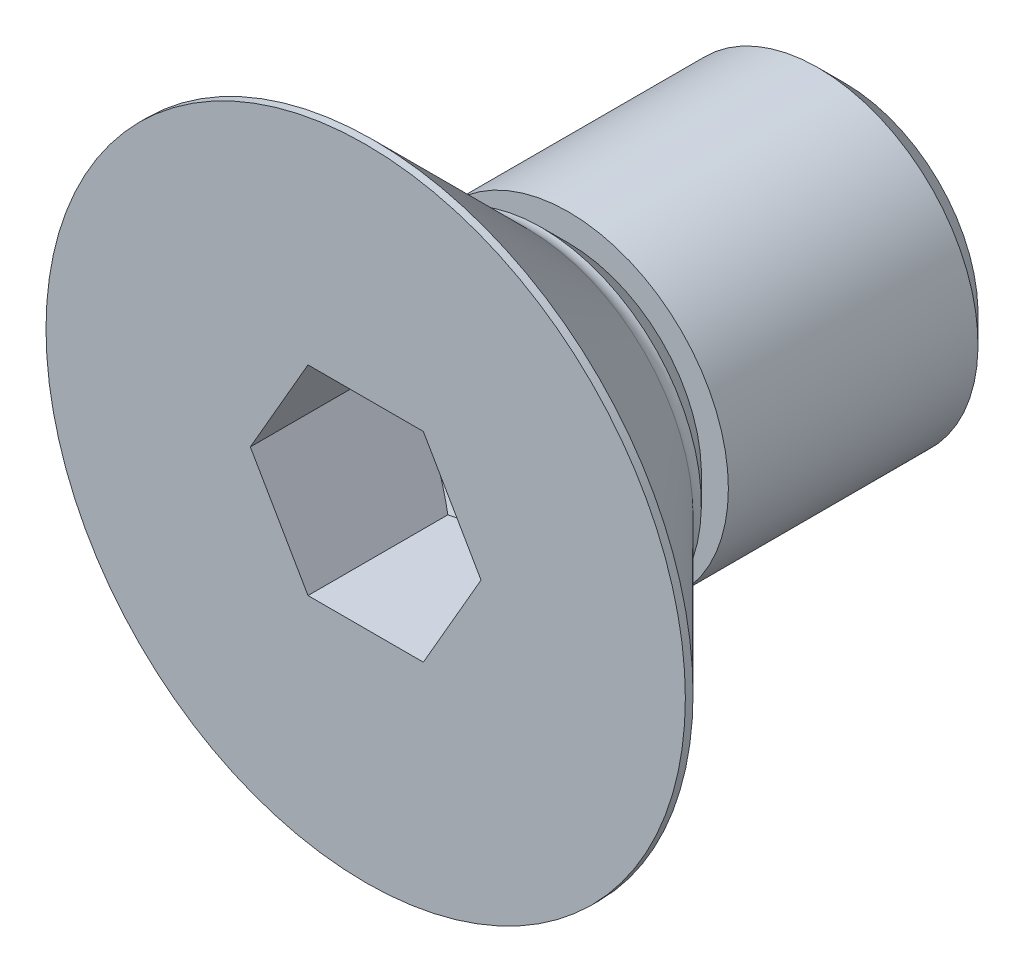
ISO-10303-21;
HEADER;
FILE_DESCRIPTION(('STEP AP214'),'2;1');
FILE_NAME('part.step','',(''),(''),'','','');
FILE_SCHEMA(('AUTOMOTIVE_DESIGN { 1 0 10303 214 1 1 1 1 }'));
ENDSEC;
DATA;
#1=APPLICATION_CONTEXT('core data for automotive mechanical design processes');
#2=APPLICATION_PROTOCOL_DEFINITION('international standard','automotive_design',2000,#1);
#3=PRODUCT_CONTEXT('',#1,'mechanical');
#4=PRODUCT('Part','Part','',(#3));
#5=PRODUCT_RELATED_PRODUCT_CATEGORY('part','',(#4));
#6=PRODUCT_DEFINITION_FORMATION('','',#4);
#7=PRODUCT_DEFINITION_CONTEXT('part definition',#1,'design');
#8=PRODUCT_DEFINITION('design','',#6,#7);
#9=PRODUCT_DEFINITION_SHAPE('','',#8);
#10=(LENGTH_UNIT() NAMED_UNIT(*) SI_UNIT(.MILLI.,.METRE.));
#11=(NAMED_UNIT(*) PLANE_ANGLE_UNIT() SI_UNIT($,.RADIAN.));
#12=(NAMED_UNIT(*) SI_UNIT($,.STERADIAN.) SOLID_ANGLE_UNIT());
#13=UNCERTAINTY_MEASURE_WITH_UNIT(LENGTH_MEASURE(1.E-05),#10,'distance_accuracy_value','');
#14=(GEOMETRIC_REPRESENTATION_CONTEXT(3) GLOBAL_UNCERTAINTY_ASSIGNED_CONTEXT((#13)) GLOBAL_UNIT_ASSIGNED_CONTEXT((#10,
#11,#12)) REPRESENTATION_CONTEXT('',''));
#15=CARTESIAN_POINT('',(0.,0.,0.));
#16=DIRECTION('',(0.,0.,1.));
#17=DIRECTION('',(1.,0.,0.));
#18=AXIS2_PLACEMENT_3D('',#15,#16,#17);
#19=CARTESIAN_POINT('',(0.,1.66171875,-12.));
#20=DIRECTION('',(0.,0.,-1.));
#21=DIRECTION('',(0.,1.,0.));
#22=AXIS2_PLACEMENT_3D('',#19,#20,#21);
#23=PLANE('',#22);
#24=CARTESIAN_POINT('',(0.,0.,-12.));
#25=DIRECTION('',(0.,0.,-1.));
#26=DIRECTION('',(0.,1.,0.));
#27=AXIS2_PLACEMENT_3D('',#24,#25,#26);
#28=CIRCLE('',#27,3.3234375);
#29=CARTESIAN_POINT('',(0.,3.3234375,-12.));
#30=VERTEX_POINT('',#29);
#31=EDGE_CURVE('E11',#30,#30,#28,.T.);
#32=ORIENTED_EDGE('',*,*,#31,.T.);
#33=EDGE_LOOP('',(#32));
#34=FACE_BOUND('',#33,.T.);
#35=ADVANCED_FACE('F17',(#34),#23,.T.);
#36=CARTESIAN_POINT('',(0.,0.,-11.66171875));
#37=DIRECTION('',(0.,0.,1.));
#38=DIRECTION('',(0.,1.,0.));
#39=AXIS2_PLACEMENT_3D('',#36,#37,#38);
#40=CONICAL_SURFACE('',#39,3.66171875,0.785398163397449);
#41=CARTESIAN_POINT('',(0.,0.,-11.3234375));
#42=DIRECTION('',(0.,0.,-1.));
#43=DIRECTION('',(0.,1.,0.));
#44=AXIS2_PLACEMENT_3D('',#41,#42,#43);
#45=CIRCLE('',#44,4.);
#46=CARTESIAN_POINT('',(0.,4.,-11.3234375));
#47=VERTEX_POINT('',#46);
#48=EDGE_CURVE('E28',#47,#47,#45,.T.);
#49=ORIENTED_EDGE('',*,*,#48,.T.);
#50=EDGE_LOOP('',(#49));
#51=FACE_BOUND('',#50,.T.);
#52=ORIENTED_EDGE('',*,*,#31,.F.);
#53=EDGE_LOOP('',(#52));
#54=FACE_BOUND('',#53,.T.);
#55=ADVANCED_FACE('F204',(#51,#54),#40,.T.);
#56=CARTESIAN_POINT('',(0.,0.,-8.11171875));
#57=DIRECTION('',(0.,0.,1.));
#58=DIRECTION('',(0.,1.,0.));
#59=AXIS2_PLACEMENT_3D('',#56,#57,#58);
#60=CYLINDRICAL_SURFACE('',#59,4.);
#61=ORIENTED_EDGE('',*,*,#48,.F.);
#62=EDGE_LOOP('',(#61));
#63=FACE_BOUND('',#62,.T.);
#64=CARTESIAN_POINT('',(0.,0.,-5.0765625));
#65=DIRECTION('',(0.,0.,-1.));
#66=DIRECTION('',(0.,1.,0.));
#67=AXIS2_PLACEMENT_3D('',#64,#65,#66);
#68=CIRCLE('',#67,4.);
#69=CARTESIAN_POINT('',(0.,-4.,-5.0765625));
#70=VERTEX_POINT('',#69);
#71=EDGE_CURVE('E181',#70,#70,#68,.T.);
#72=ORIENTED_EDGE('',*,*,#71,.T.);
#73=EDGE_LOOP('',(#72));
#74=FACE_BOUND('',#73,.T.);
#75=ADVANCED_FACE('F189',(#63,#74),#60,.T.);
#76=CARTESIAN_POINT('',(0.,0.,-4.4));
#77=DIRECTION('',(0.,0.,-1.));
#78=DIRECTION('',(-1.,0.,0.));
#79=AXIS2_PLACEMENT_3D('',#76,#77,#78);
#80=TOROIDAL_SURFACE('',#79,4.5,0.5);
#81=CARTESIAN_POINT('',(0.,0.,-4.04644660940673));
#82=DIRECTION('',(0.,0.,-1.));
#83=DIRECTION('',(0.,1.,0.));
#84=AXIS2_PLACEMENT_3D('',#81,#82,#83);
#85=CIRCLE('',#84,4.14644660940673);
#86=CARTESIAN_POINT('',(0.,4.14644660940673,-4.04644660940673));
#87=VERTEX_POINT('',#86);
#88=EDGE_CURVE('E137',#87,#87,#85,.T.);
#89=ORIENTED_EDGE('',*,*,#88,.T.);
#90=EDGE_LOOP('',(#89));
#91=FACE_BOUND('',#90,.T.);
#92=CARTESIAN_POINT('',(0.,0.,-4.4));
#93=DIRECTION('',(0.,0.,-1.));
#94=DIRECTION('',(0.,1.,0.));
#95=AXIS2_PLACEMENT_3D('',#92,#93,#94);
#96=CIRCLE('',#95,4.);
#97=CARTESIAN_POINT('',(0.,4.,-4.4));
#98=VERTEX_POINT('',#97);
#99=EDGE_CURVE('E130',#98,#98,#96,.T.);
#100=ORIENTED_EDGE('',*,*,#99,.F.);
#101=EDGE_LOOP('',(#100));
#102=FACE_BOUND('',#101,.T.);
#103=ADVANCED_FACE('F213',(#91,#102),#80,.F.);
#104=CARTESIAN_POINT('',(0.,0.,-2.11966991411009));
#105=DIRECTION('',(0.,0.,1.));
#106=DIRECTION('',(0.,1.,0.));
#107=AXIS2_PLACEMENT_3D('',#104,#105,#106);
#108=CONICAL_SURFACE('',#107,6.07322330470336,0.785398163397449);
#109=CARTESIAN_POINT('',(0.,0.,-0.192893218813454));
#110=DIRECTION('',(0.,0.,-1.));
#111=DIRECTION('',(0.,1.,0.));
#112=AXIS2_PLACEMENT_3D('',#109,#110,#111);
#113=CIRCLE('',#112,8.);
#114=CARTESIAN_POINT('',(0.,8.,-0.192893218813454));
#115=VERTEX_POINT('',#114);
#116=EDGE_CURVE('E175',#115,#115,#113,.T.);
#117=ORIENTED_EDGE('',*,*,#116,.T.);
#118=EDGE_LOOP('',(#117));
#119=FACE_BOUND('',#118,.T.);
#120=ORIENTED_EDGE('',*,*,#88,.F.);
#121=EDGE_LOOP('',(#120));
#122=FACE_BOUND('',#121,.T.);
#123=ADVANCED_FACE('F218',(#119,#122),#108,.T.);
#124=CARTESIAN_POINT('',(0.,0.,-0.0964466094067262));
#125=DIRECTION('',(0.,0.,1.));
#126=DIRECTION('',(0.,1.,0.));
#127=AXIS2_PLACEMENT_3D('',#124,#125,#126);
#128=CYLINDRICAL_SURFACE('',#127,8.);
#129=CARTESIAN_POINT('',(0.,0.,0.));
#130=DIRECTION('',(0.,0.,-1.));
#131=DIRECTION('',(0.,1.,0.));
#132=AXIS2_PLACEMENT_3D('',#129,#130,#131);
#133=CIRCLE('',#132,8.);
#134=CARTESIAN_POINT('',(0.,8.,0.));
#135=VERTEX_POINT('',#134);
#136=EDGE_CURVE('E149',#135,#135,#133,.T.);
#137=ORIENTED_EDGE('',*,*,#136,.T.);
#138=EDGE_LOOP('',(#137));
#139=FACE_BOUND('',#138,.T.);
#140=ORIENTED_EDGE('',*,*,#116,.F.);
#141=EDGE_LOOP('',(#140));
#142=FACE_BOUND('',#141,.T.);
#143=ADVANCED_FACE('F221',(#139,#142),#128,.T.);
#144=CARTESIAN_POINT('',(0.,4.,0.));
#145=DIRECTION('',(0.,0.,1.));
#146=DIRECTION('',(0.,-1.,0.));
#147=AXIS2_PLACEMENT_3D('',#144,#145,#146);
#148=PLANE('',#147);
#149=ORIENTED_EDGE('',*,*,#136,.F.);
#150=EDGE_LOOP('',(#149));
#151=FACE_BOUND('',#150,.T.);
#152=DIRECTION('',(-0.5,0.866025403784439,0.));
#153=VECTOR('',#152,1.);
#154=CARTESIAN_POINT('',(-3.03108790378444,0.250000582812635,0.));
#155=LINE('',#154,#153);
#156=CARTESIAN_POINT('',(-1.443375,-2.49999883437473,0.));
#157=VERTEX_POINT('',#156);
#158=CARTESIAN_POINT('',(-2.88675,0.,0.));
#159=VERTEX_POINT('',#158);
#160=EDGE_CURVE('E146',#157,#159,#155,.T.);
#161=ORIENTED_EDGE('',*,*,#160,.T.);
#162=DIRECTION('',(0.5,0.866025403784439,0.));
#163=VECTOR('',#162,1.);
#164=CARTESIAN_POINT('',(-1.29903709621556,2.74999941718736,0.));
#165=LINE('',#164,#163);
#166=CARTESIAN_POINT('',(-1.443375,2.49999883437473,0.));
#167=VERTEX_POINT('',#166);
#168=EDGE_CURVE('E97',#159,#167,#165,.T.);
#169=ORIENTED_EDGE('',*,*,#168,.T.);
#170=DIRECTION('',(1.,0.,0.));
#171=VECTOR('',#170,1.);
#172=CARTESIAN_POINT('',(0.,2.49999883437473,0.));
#173=LINE('',#172,#171);
#174=CARTESIAN_POINT('',(1.443375,2.49999883437473,0.));
#175=VERTEX_POINT('',#174);
#176=EDGE_CURVE('E72',#167,#175,#173,.T.);
#177=ORIENTED_EDGE('',*,*,#176,.T.);
#178=DIRECTION('',(0.5,-0.866025403784439,0.));
#179=VECTOR('',#178,1.);
#180=CARTESIAN_POINT('',(1.29903709621556,2.74999941718736,0.));
#181=LINE('',#180,#179);
#182=CARTESIAN_POINT('',(2.88675,0.,0.));
#183=VERTEX_POINT('',#182);
#184=EDGE_CURVE('E127',#175,#183,#181,.T.);
#185=ORIENTED_EDGE('',*,*,#184,.T.);
#186=DIRECTION('',(-0.5,-0.866025403784439,0.));
#187=VECTOR('',#186,1.);
#188=CARTESIAN_POINT('',(3.03108790378444,0.250000582812635,0.));
#189=LINE('',#188,#187);
#190=CARTESIAN_POINT('',(1.443375,-2.49999883437473,0.));
#191=VERTEX_POINT('',#190);
#192=EDGE_CURVE('E61',#183,#191,#189,.T.);
#193=ORIENTED_EDGE('',*,*,#192,.T.);
#194=DIRECTION('',(-1.,0.,0.));
#195=VECTOR('',#194,1.);
#196=CARTESIAN_POINT('',(0.,-2.49999883437473,0.));
#197=LINE('',#196,#195);
#198=EDGE_CURVE('E167',#191,#157,#197,.T.);
#199=ORIENTED_EDGE('',*,*,#198,.T.);
#200=EDGE_LOOP('',(#161,#169,#177,#185,#193,#199));
#201=FACE_BOUND('',#200,.T.);
#202=ADVANCED_FACE('F229',(#151,#201),#148,.T.);
#203=CARTESIAN_POINT('',(-2.1650625,1.24999941718736,1.));
#204=DIRECTION('',(-0.866025403784439,0.5,0.));
#205=DIRECTION('',(0.5,0.866025403784439,0.));
#206=AXIS2_PLACEMENT_3D('',#203,#204,#205);
#207=PLANE('',#206);
#208=ORIENTED_EDGE('',*,*,#168,.F.);
#209=DIRECTION('',(0.,0.,-1.));
#210=VECTOR('',#209,1.);
#211=CARTESIAN_POINT('',(-2.88675,0.,1.));
#212=LINE('',#211,#210);
#213=CARTESIAN_POINT('',(-2.88675,0.,-3.5));
#214=VERTEX_POINT('',#213);
#215=EDGE_CURVE('E100',#159,#214,#212,.T.);
#216=ORIENTED_EDGE('',*,*,#215,.T.);
#217=CARTESIAN_POINT('',(-2.88675,0.,-3.5));
#218=CARTESIAN_POINT('',(-2.1650625,1.24999941718736,-3.9166664723958));
#219=CARTESIAN_POINT('',(-1.443375,2.49999883437473,-3.5));
#220=(BOUNDED_CURVE() B_SPLINE_CURVE(2,(#217,#218,#219),.UNSPECIFIED.,.F.,
.F.) B_SPLINE_CURVE_WITH_KNOTS((3,3),(0.,2.92108898323611),
.UNSPECIFIED.) CURVE() GEOMETRIC_REPRESENTATION_ITEM() RATIONAL_B_SPLINE_CURVE((1.,
1.15470053837925,1.)) REPRESENTATION_ITEM(''));
#221=CARTESIAN_POINT('',(-1.443375,2.49999883437473,-3.5));
#222=VERTEX_POINT('',#221);
#223=EDGE_CURVE('E152',#214,#222,#220,.T.);
#224=ORIENTED_EDGE('',*,*,#223,.T.);
#225=DIRECTION('',(0.,0.,-1.));
#226=VECTOR('',#225,1.);
#227=CARTESIAN_POINT('',(-1.443375,2.49999883437473,1.));
#228=LINE('',#227,#226);
#229=EDGE_CURVE('E150',#167,#222,#228,.T.);
#230=ORIENTED_EDGE('',*,*,#229,.F.);
#231=EDGE_LOOP('',(#208,#216,#224,#230));
#232=FACE_BOUND('',#231,.T.);
#233=ADVANCED_FACE('F233',(#232),#207,.F.);
#234=CARTESIAN_POINT('',(0.,2.49999883437473,1.));
#235=DIRECTION('',(0.,1.,0.));
#236=DIRECTION('',(1.,0.,0.));
#237=AXIS2_PLACEMENT_3D('',#234,#235,#236);
#238=PLANE('',#237);
#239=ORIENTED_EDGE('',*,*,#176,.F.);
#240=ORIENTED_EDGE('',*,*,#229,.T.);
#241=CARTESIAN_POINT('',(-1.443375,2.49999883437473,-3.5));
#242=CARTESIAN_POINT('',(0.,2.49999883437473,-3.91666647239579));
#243=CARTESIAN_POINT('',(1.443375,2.49999883437473,-3.5));
#244=(BOUNDED_CURVE() B_SPLINE_CURVE(2,(#241,#242,#243),.UNSPECIFIED.,.F.,
.F.) B_SPLINE_CURVE_WITH_KNOTS((3,3),(0.,2.92108898323611),
.UNSPECIFIED.) CURVE() GEOMETRIC_REPRESENTATION_ITEM() RATIONAL_B_SPLINE_CURVE((1.,
1.15470053837925,1.)) REPRESENTATION_ITEM(''));
#245=CARTESIAN_POINT('',(1.443375,2.49999883437473,-3.5));
#246=VERTEX_POINT('',#245);
#247=EDGE_CURVE('E119',#222,#246,#244,.T.);
#248=ORIENTED_EDGE('',*,*,#247,.T.);
#249=DIRECTION('',(0.,0.,-1.));
#250=VECTOR('',#249,1.);
#251=CARTESIAN_POINT('',(1.443375,2.49999883437473,1.));
#252=LINE('',#251,#250);
#253=EDGE_CURVE('E124',#175,#246,#252,.T.);
#254=ORIENTED_EDGE('',*,*,#253,.F.);
#255=EDGE_LOOP('',(#239,#240,#248,#254));
#256=FACE_BOUND('',#255,.T.);
#257=ADVANCED_FACE('F231',(#256),#238,.F.);
#258=CARTESIAN_POINT('',(-2.1650625,-1.24999941718736,1.));
#259=DIRECTION('',(-0.866025403784439,-0.5,0.));
#260=DIRECTION('',(-0.5,0.866025403784439,0.));
#261=AXIS2_PLACEMENT_3D('',#258,#259,#260);
#262=PLANE('',#261);
#263=ORIENTED_EDGE('',*,*,#160,.F.);
#264=DIRECTION('',(0.,0.,-1.));
#265=VECTOR('',#264,1.);
#266=CARTESIAN_POINT('',(-1.443375,-2.49999883437473,1.));
#267=LINE('',#266,#265);
#268=CARTESIAN_POINT('',(-1.443375,-2.49999883437473,-3.5));
#269=VERTEX_POINT('',#268);
#270=EDGE_CURVE('E134',#157,#269,#267,.T.);
#271=ORIENTED_EDGE('',*,*,#270,.T.);
#272=CARTESIAN_POINT('',(-1.443375,-2.49999883437473,-3.5));
#273=CARTESIAN_POINT('',(-2.1650625,-1.24999941718737,-3.91666647239579));
#274=CARTESIAN_POINT('',(-2.88675,0.,-3.5));
#275=(BOUNDED_CURVE() B_SPLINE_CURVE(2,(#272,#273,#274),.UNSPECIFIED.,.F.,
.F.) B_SPLINE_CURVE_WITH_KNOTS((3,3),(0.,2.92108898323611),
.UNSPECIFIED.) CURVE() GEOMETRIC_REPRESENTATION_ITEM() RATIONAL_B_SPLINE_CURVE((1.,
1.15470053837925,1.)) REPRESENTATION_ITEM(''));
#276=EDGE_CURVE('E20',#269,#214,#275,.T.);
#277=ORIENTED_EDGE('',*,*,#276,.T.);
#278=ORIENTED_EDGE('',*,*,#215,.F.);
#279=EDGE_LOOP('',(#263,#271,#277,#278));
#280=FACE_BOUND('',#279,.T.);
#281=ADVANCED_FACE('F111',(#280),#262,.F.);
#282=CARTESIAN_POINT('',(0.,0.,-4.33333294479158));
#283=DIRECTION('',(0.,0.,1.));
#284=DIRECTION('',(0.,1.,0.));
#285=AXIS2_PLACEMENT_3D('',#282,#283,#284);
#286=CONICAL_SURFACE('',#285,1.443375,1.0471975511966);
#287=CARTESIAN_POINT('',(0.,0.,-5.16666588958315));
#288=VERTEX_POINT('',#287);
#289=VERTEX_LOOP('',#288);
#290=FACE_BOUND('',#289,.T.);
#291=CARTESIAN_POINT('',(1.443375,2.49999883437473,-3.5));
#292=CARTESIAN_POINT('',(2.1650625,1.24999941718736,-3.91666647239578));
#293=CARTESIAN_POINT('',(2.88675,0.,-3.5));
#294=(BOUNDED_CURVE() B_SPLINE_CURVE(2,(#291,#292,#293),.UNSPECIFIED.,.F.,
.F.) B_SPLINE_CURVE_WITH_KNOTS((3,3),(0.,2.9210889832361),
.UNSPECIFIED.) CURVE() GEOMETRIC_REPRESENTATION_ITEM() RATIONAL_B_SPLINE_CURVE((1.,
1.15470053837926,1.)) REPRESENTATION_ITEM(''));
#295=CARTESIAN_POINT('',(2.88675,0.,-3.5));
#296=VERTEX_POINT('',#295);
#297=EDGE_CURVE('E116',#246,#296,#294,.T.);
#298=ORIENTED_EDGE('',*,*,#297,.F.);
#299=ORIENTED_EDGE('',*,*,#247,.F.);
#300=ORIENTED_EDGE('',*,*,#223,.F.);
#301=ORIENTED_EDGE('',*,*,#276,.F.);
#302=CARTESIAN_POINT('',(1.443375,-2.49999883437473,-3.5));
#303=CARTESIAN_POINT('',(0.,-2.49999883437473,-3.91666647239579));
#304=CARTESIAN_POINT('',(-1.443375,-2.49999883437473,-3.5));
#305=(BOUNDED_CURVE() B_SPLINE_CURVE(2,(#302,#303,#304),.UNSPECIFIED.,.F.,
.F.) B_SPLINE_CURVE_WITH_KNOTS((3,3),(0.,2.92108898323611),
.UNSPECIFIED.) CURVE() GEOMETRIC_REPRESENTATION_ITEM() RATIONAL_B_SPLINE_CURVE((1.,
1.15470053837925,1.)) REPRESENTATION_ITEM(''));
#306=CARTESIAN_POINT('',(1.443375,-2.49999883437473,-3.5));
#307=VERTEX_POINT('',#306);
#308=EDGE_CURVE('E162',#307,#269,#305,.T.);
#309=ORIENTED_EDGE('',*,*,#308,.F.);
#310=CARTESIAN_POINT('',(2.88675,0.,-3.5));
#311=CARTESIAN_POINT('',(2.1650625,-1.24999941718736,-3.91666647239578));
#312=CARTESIAN_POINT('',(1.443375,-2.49999883437473,-3.5));
#313=(BOUNDED_CURVE() B_SPLINE_CURVE(2,(#310,#311,#312),.UNSPECIFIED.,.F.,
.F.) B_SPLINE_CURVE_WITH_KNOTS((3,3),(0.,2.9210889832361),
.UNSPECIFIED.) CURVE() GEOMETRIC_REPRESENTATION_ITEM() RATIONAL_B_SPLINE_CURVE((1.,
1.15470053837926,1.)) REPRESENTATION_ITEM(''));
#314=EDGE_CURVE('E121',#296,#307,#313,.T.);
#315=ORIENTED_EDGE('',*,*,#314,.F.);
#316=EDGE_LOOP('',(#298,#299,#300,#301,#309,#315));
#317=FACE_BOUND('',#316,.T.);
#318=ADVANCED_FACE('F107',(#290,#317),#286,.F.);
#319=CARTESIAN_POINT('',(0.,-2.49999883437473,1.));
#320=DIRECTION('',(0.,-1.,0.));
#321=DIRECTION('',(-1.,0.,0.));
#322=AXIS2_PLACEMENT_3D('',#319,#320,#321);
#323=PLANE('',#322);
#324=ORIENTED_EDGE('',*,*,#198,.F.);
#325=DIRECTION('',(0.,0.,-1.));
#326=VECTOR('',#325,1.);
#327=CARTESIAN_POINT('',(1.443375,-2.49999883437473,1.));
#328=LINE('',#327,#326);
#329=EDGE_CURVE('E141',#191,#307,#328,.T.);
#330=ORIENTED_EDGE('',*,*,#329,.T.);
#331=ORIENTED_EDGE('',*,*,#308,.T.);
#332=ORIENTED_EDGE('',*,*,#270,.F.);
#333=EDGE_LOOP('',(#324,#330,#331,#332));
#334=FACE_BOUND('',#333,.T.);
#335=ADVANCED_FACE('F110',(#334),#323,.F.);
#336=CARTESIAN_POINT('',(2.1650625,-1.24999941718736,1.));
#337=DIRECTION('',(0.866025403784439,-0.5,0.));
#338=DIRECTION('',(-0.5,-0.866025403784439,0.));
#339=AXIS2_PLACEMENT_3D('',#336,#337,#338);
#340=PLANE('',#339);
#341=ORIENTED_EDGE('',*,*,#192,.F.);
#342=DIRECTION('',(0.,0.,-1.));
#343=VECTOR('',#342,1.);
#344=CARTESIAN_POINT('',(2.88675,0.,1.));
#345=LINE('',#344,#343);
#346=EDGE_CURVE('E123',#183,#296,#345,.T.);
#347=ORIENTED_EDGE('',*,*,#346,.T.);
#348=ORIENTED_EDGE('',*,*,#314,.T.);
#349=ORIENTED_EDGE('',*,*,#329,.F.);
#350=EDGE_LOOP('',(#341,#347,#348,#349));
#351=FACE_BOUND('',#350,.T.);
#352=ADVANCED_FACE('F225',(#351),#340,.F.);
#353=CARTESIAN_POINT('',(2.1650625,1.24999941718736,1.));
#354=DIRECTION('',(0.866025403784439,0.5,0.));
#355=DIRECTION('',(0.5,-0.866025403784439,0.));
#356=AXIS2_PLACEMENT_3D('',#353,#354,#355);
#357=PLANE('',#356);
#358=ORIENTED_EDGE('',*,*,#184,.F.);
#359=ORIENTED_EDGE('',*,*,#253,.T.);
#360=ORIENTED_EDGE('',*,*,#297,.T.);
#361=ORIENTED_EDGE('',*,*,#346,.F.);
#362=EDGE_LOOP('',(#358,#359,#360,#361));
#363=FACE_BOUND('',#362,.T.);
#364=ADVANCED_FACE('F126',(#363),#357,.F.);
#365=CARTESIAN_POINT('',(0.,0.,-4.73828125));
#366=DIRECTION('',(0.,0.,1.));
#367=DIRECTION('',(0.,1.,0.));
#368=AXIS2_PLACEMENT_3D('',#365,#366,#367);
#369=CONICAL_SURFACE('',#368,3.66171875,0.785398163397448);
#370=CARTESIAN_POINT('',(0.,0.,-5.0765625));
#371=DIRECTION('',(0.,0.,-1.));
#372=DIRECTION('',(0.,1.,0.));
#373=AXIS2_PLACEMENT_3D('',#370,#371,#372);
#374=CIRCLE('',#373,3.3234375);
#375=CARTESIAN_POINT('',(0.,3.3234375,-5.0765625));
#376=VERTEX_POINT('',#375);
#377=EDGE_CURVE('E161',#376,#376,#374,.T.);
#378=ORIENTED_EDGE('',*,*,#377,.F.);
#379=EDGE_LOOP('',(#378));
#380=FACE_BOUND('',#379,.T.);
#381=ORIENTED_EDGE('',*,*,#99,.T.);
#382=EDGE_LOOP('',(#381));
#383=FACE_BOUND('',#382,.T.);
#384=ADVANCED_FACE('F193',(#380,#383),#369,.T.);
#385=CARTESIAN_POINT('',(0.,4.16171875,-5.0765625));
#386=DIRECTION('',(0.,0.,-1.));
#387=DIRECTION('',(0.,1.,0.));
#388=AXIS2_PLACEMENT_3D('',#385,#386,#387);
#389=PLANE('',#388);
#390=ORIENTED_EDGE('',*,*,#377,.T.);
#391=EDGE_LOOP('',(#390));
#392=FACE_BOUND('',#391,.T.);
#393=ORIENTED_EDGE('',*,*,#71,.F.);
#394=EDGE_LOOP('',(#393));
#395=FACE_BOUND('',#394,.T.);
#396=ADVANCED_FACE('F191',(#392,#395),#389,.F.);
#397=CLOSED_SHELL('',(#35,#55,#75,#103,#123,#143,#202,#233,#257,#281,#318,#335,#352,#364,#384,#396));
#398=MANIFOLD_SOLID_BREP('B1',#397);
#399=ADVANCED_BREP_SHAPE_REPRESENTATION('',(#18,#398),#14);
#400=SHAPE_DEFINITION_REPRESENTATION(#9,#399);
ENDSEC;
END-ISO-10303-21;
